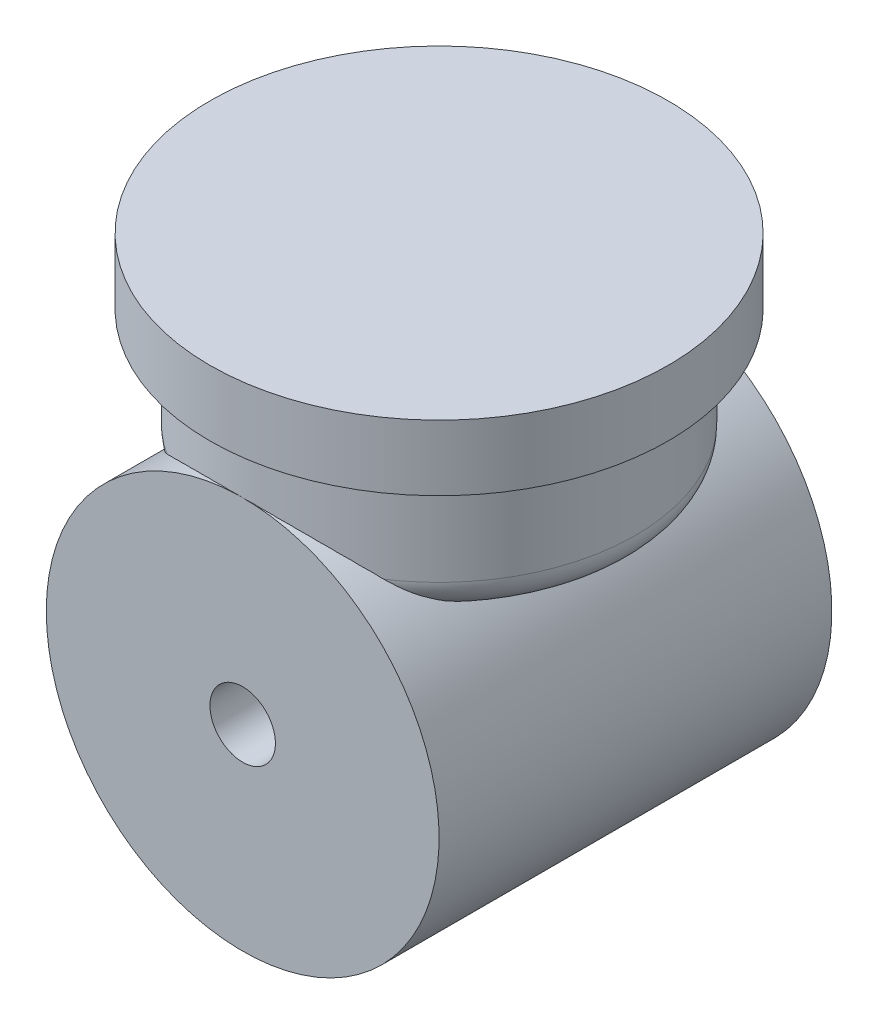
ISO-10303-21;
HEADER;
FILE_DESCRIPTION(('STEP AP214'),'2;1');
FILE_NAME('part.step','',(''),(''),'','','');
FILE_SCHEMA(('AUTOMOTIVE_DESIGN { 1 0 10303 214 1 1 1 1 }'));
ENDSEC;
DATA;
#1=APPLICATION_CONTEXT('core data for automotive mechanical design processes');
#2=APPLICATION_PROTOCOL_DEFINITION('international standard','automotive_design',2000,#1);
#3=PRODUCT_CONTEXT('',#1,'mechanical');
#4=PRODUCT('Part','Part','',(#3));
#5=PRODUCT_RELATED_PRODUCT_CATEGORY('part','',(#4));
#6=PRODUCT_DEFINITION_FORMATION('','',#4);
#7=PRODUCT_DEFINITION_CONTEXT('part definition',#1,'design');
#8=PRODUCT_DEFINITION('design','',#6,#7);
#9=PRODUCT_DEFINITION_SHAPE('','',#8);
#10=(LENGTH_UNIT() NAMED_UNIT(*) SI_UNIT(.MILLI.,.METRE.));
#11=(NAMED_UNIT(*) PLANE_ANGLE_UNIT() SI_UNIT($,.RADIAN.));
#12=(NAMED_UNIT(*) SI_UNIT($,.STERADIAN.) SOLID_ANGLE_UNIT());
#13=UNCERTAINTY_MEASURE_WITH_UNIT(LENGTH_MEASURE(1.E-05),#10,'distance_accuracy_value','');
#14=(GEOMETRIC_REPRESENTATION_CONTEXT(3) GLOBAL_UNCERTAINTY_ASSIGNED_CONTEXT((#13)) GLOBAL_UNIT_ASSIGNED_CONTEXT((#10,
#11,#12)) REPRESENTATION_CONTEXT('',''));
#15=CARTESIAN_POINT('',(0.,0.,0.));
#16=DIRECTION('',(0.,0.,1.));
#17=DIRECTION('',(1.,0.,0.));
#18=AXIS2_PLACEMENT_3D('',#15,#16,#17);
#19=CARTESIAN_POINT('',(0.,-20.,-30.));
#20=DIRECTION('',(0.,0.,1.));
#21=DIRECTION('',(1.,0.,0.));
#22=AXIS2_PLACEMENT_3D('',#19,#20,#21);
#23=CYLINDRICAL_SURFACE('',#22,30.);
#24=CARTESIAN_POINT('',(0.,-20.,-30.));
#25=DIRECTION('',(0.,0.,-1.));
#26=DIRECTION('',(-1.,0.,0.));
#27=AXIS2_PLACEMENT_3D('',#24,#25,#26);
#28=CIRCLE('',#27,30.);
#29=CARTESIAN_POINT('',(-30.,-20.,-30.));
#30=VERTEX_POINT('',#29);
#31=EDGE_CURVE('E11',#30,#30,#28,.T.);
#32=ORIENTED_EDGE('',*,*,#31,.F.);
#33=EDGE_LOOP('',(#32));
#34=FACE_BOUND('',#33,.T.);
#35=CARTESIAN_POINT('',(0.,-20.,30.));
#36=DIRECTION('',(0.,0.,-1.));
#37=DIRECTION('',(-1.,0.,0.));
#38=AXIS2_PLACEMENT_3D('',#35,#36,#37);
#39=CIRCLE('',#38,30.);
#40=CARTESIAN_POINT('',(-30.,-20.,30.));
#41=VERTEX_POINT('',#40);
#42=EDGE_CURVE('E46',#41,#41,#39,.T.);
#43=ORIENTED_EDGE('',*,*,#42,.T.);
#44=EDGE_LOOP('',(#43));
#45=FACE_BOUND('',#44,.T.);
#46=ADVANCED_FACE('F39',(#34,#45),#23,.T.);
#47=CARTESIAN_POINT('',(0.,-20.,-30.));
#48=DIRECTION('',(0.,0.,-1.));
#49=DIRECTION('',(-1.,0.,0.));
#50=AXIS2_PLACEMENT_3D('',#47,#48,#49);
#51=PLANE('',#50);
#52=CARTESIAN_POINT('',(0.,-20.,-30.));
#53=DIRECTION('',(0.,0.,-1.));
#54=DIRECTION('',(-1.,0.,0.));
#55=AXIS2_PLACEMENT_3D('',#52,#53,#54);
#56=CIRCLE('',#55,5.);
#57=CARTESIAN_POINT('',(-5.,-20.,-30.));
#58=VERTEX_POINT('',#57);
#59=EDGE_CURVE('E52',#58,#58,#56,.T.);
#60=ORIENTED_EDGE('',*,*,#59,.F.);
#61=EDGE_LOOP('',(#60));
#62=FACE_BOUND('',#61,.T.);
#63=ORIENTED_EDGE('',*,*,#31,.T.);
#64=EDGE_LOOP('',(#63));
#65=FACE_BOUND('',#64,.T.);
#66=ADVANCED_FACE('F68',(#62,#65),#51,.T.);
#67=CARTESIAN_POINT('',(0.,-20.,30.));
#68=DIRECTION('',(0.,0.,-1.));
#69=DIRECTION('',(-1.,0.,0.));
#70=AXIS2_PLACEMENT_3D('',#67,#68,#69);
#71=PLANE('',#70);
#72=CARTESIAN_POINT('',(0.,-20.,30.));
#73=DIRECTION('',(0.,0.,-1.));
#74=DIRECTION('',(-1.,0.,0.));
#75=AXIS2_PLACEMENT_3D('',#72,#73,#74);
#76=CIRCLE('',#75,5.);
#77=CARTESIAN_POINT('',(-5.,-20.,30.));
#78=VERTEX_POINT('',#77);
#79=EDGE_CURVE('E42',#78,#78,#76,.T.);
#80=ORIENTED_EDGE('',*,*,#79,.T.);
#81=EDGE_LOOP('',(#80));
#82=FACE_BOUND('',#81,.T.);
#83=ORIENTED_EDGE('',*,*,#42,.F.);
#84=EDGE_LOOP('',(#83));
#85=FACE_BOUND('',#84,.T.);
#86=ADVANCED_FACE('F59',(#82,#85),#71,.F.);
#87=CARTESIAN_POINT('',(0.,-20.,35.));
#88=DIRECTION('',(0.,0.,-1.));
#89=DIRECTION('',(-1.,0.,0.));
#90=AXIS2_PLACEMENT_3D('',#87,#88,#89);
#91=CYLINDRICAL_SURFACE('',#90,5.);
#92=ORIENTED_EDGE('',*,*,#59,.T.);
#93=EDGE_LOOP('',(#92));
#94=FACE_BOUND('',#93,.T.);
#95=ORIENTED_EDGE('',*,*,#79,.F.);
#96=EDGE_LOOP('',(#95));
#97=FACE_BOUND('',#96,.T.);
#98=ADVANCED_FACE('F62',(#94,#97),#91,.F.);
#99=CLOSED_SHELL('',(#46,#66,#86,#98));
#100=MANIFOLD_SOLID_BREP('B2',#99);
#101=CARTESIAN_POINT('',(0.,20.,0.));
#102=DIRECTION('',(0.,-1.,0.));
#103=DIRECTION('',(0.,0.,-1.));
#104=AXIS2_PLACEMENT_3D('',#101,#102,#103);
#105=CYLINDRICAL_SURFACE('',#104,30.);
#106=CARTESIAN_POINT('',(0.,5.,0.));
#107=DIRECTION('',(0.,1.,0.));
#108=DIRECTION('',(0.,0.,1.));
#109=AXIS2_PLACEMENT_3D('',#106,#107,#108);
#110=CIRCLE('',#109,30.);
#111=CARTESIAN_POINT('',(0.,5.,30.));
#112=VERTEX_POINT('',#111);
#113=EDGE_CURVE('E108',#112,#112,#110,.T.);
#114=ORIENTED_EDGE('',*,*,#113,.T.);
#115=EDGE_LOOP('',(#114));
#116=FACE_BOUND('',#115,.T.);
#117=CARTESIAN_POINT('',(0.,20.,0.));
#118=DIRECTION('',(0.,1.,0.));
#119=DIRECTION('',(0.,0.,1.));
#120=AXIS2_PLACEMENT_3D('',#117,#118,#119);
#121=CIRCLE('',#120,30.);
#122=CARTESIAN_POINT('',(0.,20.,30.));
#123=VERTEX_POINT('',#122);
#124=EDGE_CURVE('E112',#123,#123,#121,.T.);
#125=ORIENTED_EDGE('',*,*,#124,.F.);
#126=EDGE_LOOP('',(#125));
#127=FACE_BOUND('',#126,.T.);
#128=ADVANCED_FACE('F101',(#116,#127),#105,.T.);
#129=CARTESIAN_POINT('',(0.,0.,0.));
#130=DIRECTION('',(0.,1.,0.));
#131=DIRECTION('',(0.,0.,1.));
#132=AXIS2_PLACEMENT_3D('',#129,#130,#131);
#133=PLANE('',#132);
#134=CARTESIAN_POINT('',(0.,0.,0.));
#135=DIRECTION('',(0.,1.,0.));
#136=DIRECTION('',(0.,0.,1.));
#137=AXIS2_PLACEMENT_3D('',#134,#135,#136);
#138=CIRCLE('',#137,25.);
#139=CARTESIAN_POINT('',(0.,0.,25.));
#140=VERTEX_POINT('',#139);
#141=EDGE_CURVE('E38',#140,#140,#138,.F.);
#142=ORIENTED_EDGE('',*,*,#141,.T.);
#143=EDGE_LOOP('',(#142));
#144=FACE_BOUND('',#143,.T.);
#145=ADVANCED_FACE('F136',(#144),#133,.F.);
#146=CARTESIAN_POINT('',(0.,20.,0.));
#147=DIRECTION('',(0.,1.,0.));
#148=DIRECTION('',(0.,0.,1.));
#149=AXIS2_PLACEMENT_3D('',#146,#147,#148);
#150=PLANE('',#149);
#151=CARTESIAN_POINT('',(0.,20.,0.));
#152=DIRECTION('',(0.,1.,0.));
#153=DIRECTION('',(0.,0.,1.));
#154=AXIS2_PLACEMENT_3D('',#151,#152,#153);
#155=CIRCLE('',#154,35.);
#156=CARTESIAN_POINT('',(0.,20.,35.));
#157=VERTEX_POINT('',#156);
#158=EDGE_CURVE('E119',#157,#157,#155,.T.);
#159=ORIENTED_EDGE('',*,*,#158,.F.);
#160=EDGE_LOOP('',(#159));
#161=FACE_BOUND('',#160,.T.);
#162=ORIENTED_EDGE('',*,*,#124,.T.);
#163=EDGE_LOOP('',(#162));
#164=FACE_BOUND('',#163,.T.);
#165=ADVANCED_FACE('F130',(#161,#164),#150,.F.);
#166=CARTESIAN_POINT('',(0.,30.,0.));
#167=DIRECTION('',(0.,-1.,0.));
#168=DIRECTION('',(0.,0.,-1.));
#169=AXIS2_PLACEMENT_3D('',#166,#167,#168);
#170=CYLINDRICAL_SURFACE('',#169,35.);
#171=CARTESIAN_POINT('',(0.,30.,0.));
#172=DIRECTION('',(0.,1.,0.));
#173=DIRECTION('',(0.,0.,1.));
#174=AXIS2_PLACEMENT_3D('',#171,#172,#173);
#175=CIRCLE('',#174,35.);
#176=CARTESIAN_POINT('',(0.,30.,35.));
#177=VERTEX_POINT('',#176);
#178=EDGE_CURVE('E116',#177,#177,#175,.T.);
#179=ORIENTED_EDGE('',*,*,#178,.F.);
#180=EDGE_LOOP('',(#179));
#181=FACE_BOUND('',#180,.T.);
#182=ORIENTED_EDGE('',*,*,#158,.T.);
#183=EDGE_LOOP('',(#182));
#184=FACE_BOUND('',#183,.T.);
#185=ADVANCED_FACE('F127',(#181,#184),#170,.T.);
#186=CARTESIAN_POINT('',(0.,30.,0.));
#187=DIRECTION('',(0.,1.,0.));
#188=DIRECTION('',(0.,0.,1.));
#189=AXIS2_PLACEMENT_3D('',#186,#187,#188);
#190=PLANE('',#189);
#191=ORIENTED_EDGE('',*,*,#178,.T.);
#192=EDGE_LOOP('',(#191));
#193=FACE_BOUND('',#192,.T.);
#194=ADVANCED_FACE('F125',(#193),#190,.T.);
#195=CARTESIAN_POINT('',(0.,5.,0.));
#196=DIRECTION('',(0.,1.,0.));
#197=DIRECTION('',(0.,0.,1.));
#198=AXIS2_PLACEMENT_3D('',#195,#196,#197);
#199=TOROIDAL_SURFACE('',#198,25.,5.);
#200=ORIENTED_EDGE('',*,*,#141,.F.);
#201=EDGE_LOOP('',(#200));
#202=FACE_BOUND('',#201,.T.);
#203=ORIENTED_EDGE('',*,*,#113,.F.);
#204=EDGE_LOOP('',(#203));
#205=FACE_BOUND('',#204,.T.);
#206=ADVANCED_FACE('F103',(#202,#205),#199,.T.);
#207=CLOSED_SHELL('',(#128,#145,#165,#185,#194,#206));
#208=MANIFOLD_SOLID_BREP('B6',#207);
#209=ADVANCED_BREP_SHAPE_REPRESENTATION('',(#18,#100,#208),#14);
#210=SHAPE_DEFINITION_REPRESENTATION(#9,#209);
ENDSEC;
END-ISO-10303-21;
